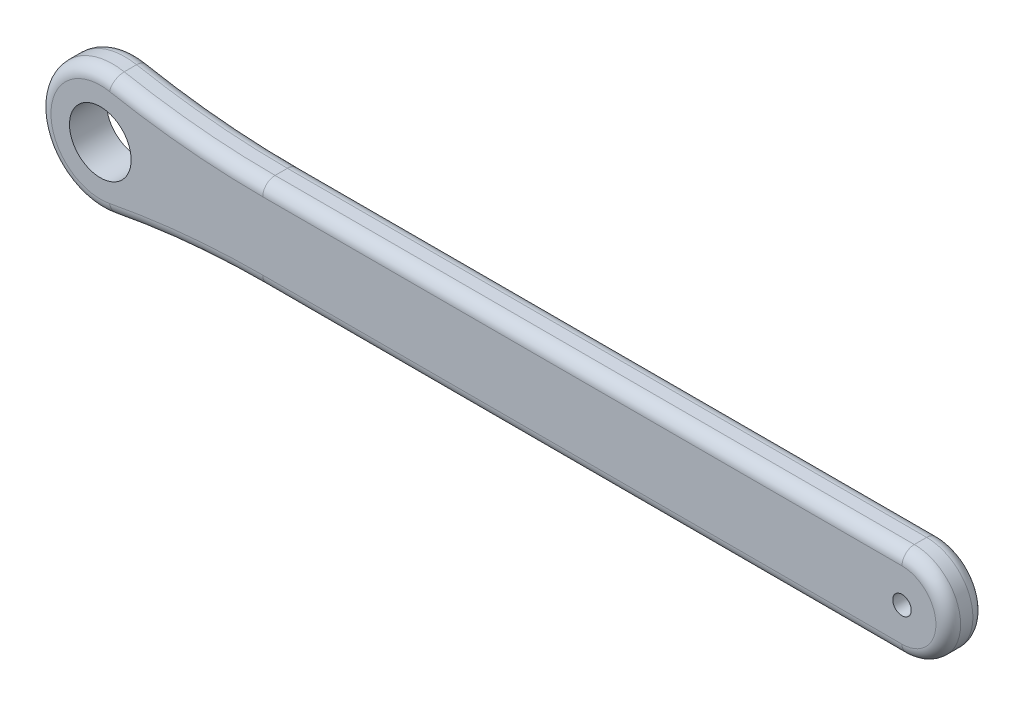
ISO-10303-21;
HEADER;
FILE_DESCRIPTION(('STEP AP214'),'2;1');
FILE_NAME('part.step','',(''),(''),'','','');
FILE_SCHEMA(('AUTOMOTIVE_DESIGN { 1 0 10303 214 1 1 1 1 }'));
ENDSEC;
DATA;
#1=APPLICATION_CONTEXT('core data for automotive mechanical design processes');
#2=APPLICATION_PROTOCOL_DEFINITION('international standard','automotive_design',2000,#1);
#3=PRODUCT_CONTEXT('',#1,'mechanical');
#4=PRODUCT('Part','Part','',(#3));
#5=PRODUCT_RELATED_PRODUCT_CATEGORY('part','',(#4));
#6=PRODUCT_DEFINITION_FORMATION('','',#4);
#7=PRODUCT_DEFINITION_CONTEXT('part definition',#1,'design');
#8=PRODUCT_DEFINITION('design','',#6,#7);
#9=PRODUCT_DEFINITION_SHAPE('','',#8);
#10=(LENGTH_UNIT() NAMED_UNIT(*) SI_UNIT(.MILLI.,.METRE.));
#11=(NAMED_UNIT(*) PLANE_ANGLE_UNIT() SI_UNIT($,.RADIAN.));
#12=(NAMED_UNIT(*) SI_UNIT($,.STERADIAN.) SOLID_ANGLE_UNIT());
#13=UNCERTAINTY_MEASURE_WITH_UNIT(LENGTH_MEASURE(1.E-05),#10,'distance_accuracy_value','');
#14=(GEOMETRIC_REPRESENTATION_CONTEXT(3) GLOBAL_UNCERTAINTY_ASSIGNED_CONTEXT((#13)) GLOBAL_UNIT_ASSIGNED_CONTEXT((#10,
#11,#12)) REPRESENTATION_CONTEXT('',''));
#15=CARTESIAN_POINT('',(0.,0.,0.));
#16=DIRECTION('',(0.,0.,1.));
#17=DIRECTION('',(1.,0.,0.));
#18=AXIS2_PLACEMENT_3D('',#15,#16,#17);
#19=CARTESIAN_POINT('',(130.,0.,6.));
#20=DIRECTION('',(0.,0.,1.));
#21=DIRECTION('',(1.,0.,0.));
#22=AXIS2_PLACEMENT_3D('',#19,#20,#21);
#23=PLANE('',#22);
#24=DIRECTION('',(1.,0.,0.));
#25=VECTOR('',#24,1.);
#26=CARTESIAN_POINT('',(130.,-5.5,6.));
#27=LINE('',#26,#25);
#28=CARTESIAN_POINT('',(26.3391343821317,-5.50000000000001,6.));
#29=VERTEX_POINT('',#28);
#30=CARTESIAN_POINT('',(130.,-5.5,6.));
#31=VERTEX_POINT('',#30);
#32=EDGE_CURVE('E226',#29,#31,#27,.T.);
#33=ORIENTED_EDGE('',*,*,#32,.T.);
#34=CARTESIAN_POINT('',(130.,0.,6.));
#35=DIRECTION('',(0.,0.,1.));
#36=DIRECTION('',(1.,0.,0.));
#37=AXIS2_PLACEMENT_3D('',#34,#35,#36);
#38=CIRCLE('',#37,5.5);
#39=CARTESIAN_POINT('',(130.,5.5,6.));
#40=VERTEX_POINT('',#39);
#41=EDGE_CURVE('E228',#31,#40,#38,.T.);
#42=ORIENTED_EDGE('',*,*,#41,.T.);
#43=DIRECTION('',(-1.,0.,0.));
#44=VECTOR('',#43,1.);
#45=CARTESIAN_POINT('',(26.3391343821319,5.50000000000001,6.));
#46=LINE('',#45,#44);
#47=CARTESIAN_POINT('',(26.3391343821319,5.50000000000001,6.));
#48=VERTEX_POINT('',#47);
#49=EDGE_CURVE('E218',#40,#48,#46,.T.);
#50=ORIENTED_EDGE('',*,*,#49,.T.);
#51=CARTESIAN_POINT('',(26.3391343821319,137.5,6.));
#52=DIRECTION('',(0.,0.,1.));
#53=DIRECTION('',(1.,0.,0.));
#54=AXIS2_PLACEMENT_3D('',#51,#52,#53);
#55=CIRCLE('',#54,132.);
#56=CARTESIAN_POINT('',(1.50509339326467,7.85714285714283,6.));
#57=VERTEX_POINT('',#56);
#58=EDGE_CURVE('E220',#48,#57,#55,.F.);
#59=ORIENTED_EDGE('',*,*,#58,.T.);
#60=CARTESIAN_POINT('',(0.,0.,6.));
#61=DIRECTION('',(0.,0.,1.));
#62=DIRECTION('',(1.,0.,0.));
#63=AXIS2_PLACEMENT_3D('',#60,#61,#62);
#64=CIRCLE('',#63,8.);
#65=CARTESIAN_POINT('',(1.50509339326467,-7.85714285714286,6.));
#66=VERTEX_POINT('',#65);
#67=EDGE_CURVE('E222',#57,#66,#64,.T.);
#68=ORIENTED_EDGE('',*,*,#67,.T.);
#69=CARTESIAN_POINT('',(26.3391343821317,-137.5,6.));
#70=DIRECTION('',(0.,0.,1.));
#71=DIRECTION('',(1.,0.,0.));
#72=AXIS2_PLACEMENT_3D('',#69,#70,#71);
#73=CIRCLE('',#72,132.);
#74=EDGE_CURVE('E224',#66,#29,#73,.F.);
#75=ORIENTED_EDGE('',*,*,#74,.T.);
#76=EDGE_LOOP('',(#33,#42,#50,#59,#68,#75));
#77=FACE_BOUND('',#76,.T.);
#78=CARTESIAN_POINT('',(0.,0.,6.));
#79=DIRECTION('',(0.,0.,1.));
#80=DIRECTION('',(1.,0.,0.));
#81=AXIS2_PLACEMENT_3D('',#78,#79,#80);
#82=CIRCLE('',#81,5.);
#83=CARTESIAN_POINT('',(5.,0.,6.));
#84=VERTEX_POINT('',#83);
#85=EDGE_CURVE('E195',#84,#84,#82,.T.);
#86=ORIENTED_EDGE('',*,*,#85,.F.);
#87=EDGE_LOOP('',(#86));
#88=FACE_BOUND('',#87,.T.);
#89=CARTESIAN_POINT('',(130.,0.,6.));
#90=DIRECTION('',(0.,0.,1.));
#91=DIRECTION('',(1.,0.,0.));
#92=AXIS2_PLACEMENT_3D('',#89,#90,#91);
#93=CIRCLE('',#92,1.5);
#94=CARTESIAN_POINT('',(131.5,0.,6.));
#95=VERTEX_POINT('',#94);
#96=EDGE_CURVE('E187',#95,#95,#93,.T.);
#97=ORIENTED_EDGE('',*,*,#96,.F.);
#98=EDGE_LOOP('',(#97));
#99=FACE_BOUND('',#98,.T.);
#100=ADVANCED_FACE('F32',(#77,#88,#99),#23,.T.);
#101=CARTESIAN_POINT('',(130.,0.,0.));
#102=DIRECTION('',(0.,0.,1.));
#103=DIRECTION('',(1.,0.,0.));
#104=AXIS2_PLACEMENT_3D('',#101,#102,#103);
#105=PLANE('',#104);
#106=DIRECTION('',(1.,0.,0.));
#107=VECTOR('',#106,1.);
#108=CARTESIAN_POINT('',(12.,3.99999999999999,0.));
#109=LINE('',#108,#107);
#110=CARTESIAN_POINT('',(12.,3.99999999999999,0.));
#111=VERTEX_POINT('',#110);
#112=CARTESIAN_POINT('',(123.,4.,0.));
#113=VERTEX_POINT('',#112);
#114=EDGE_CURVE('E177',#111,#113,#109,.T.);
#115=ORIENTED_EDGE('',*,*,#114,.F.);
#116=DIRECTION('',(0.,1.,0.));
#117=VECTOR('',#116,1.);
#118=CARTESIAN_POINT('',(12.,3.99999999999999,0.));
#119=LINE('',#118,#117);
#120=CARTESIAN_POINT('',(12.,-3.99999999999999,0.));
#121=VERTEX_POINT('',#120);
#122=EDGE_CURVE('E49',#121,#111,#119,.T.);
#123=ORIENTED_EDGE('',*,*,#122,.F.);
#124=DIRECTION('',(-1.,0.,0.));
#125=VECTOR('',#124,1.);
#126=CARTESIAN_POINT('',(12.,-3.99999999999999,0.));
#127=LINE('',#126,#125);
#128=CARTESIAN_POINT('',(123.,-4.,0.));
#129=VERTEX_POINT('',#128);
#130=EDGE_CURVE('E168',#129,#121,#127,.T.);
#131=ORIENTED_EDGE('',*,*,#130,.F.);
#132=DIRECTION('',(0.,-1.,0.));
#133=VECTOR('',#132,1.);
#134=CARTESIAN_POINT('',(123.,4.,0.));
#135=LINE('',#134,#133);
#136=EDGE_CURVE('E171',#113,#129,#135,.T.);
#137=ORIENTED_EDGE('',*,*,#136,.F.);
#138=EDGE_LOOP('',(#115,#123,#131,#137));
#139=FACE_BOUND('',#138,.T.);
#140=DIRECTION('',(-1.,0.,0.));
#141=VECTOR('',#140,1.);
#142=CARTESIAN_POINT('',(130.,5.5,0.));
#143=LINE('',#142,#141);
#144=CARTESIAN_POINT('',(26.3391343821319,5.50000000000001,0.));
#145=VERTEX_POINT('',#144);
#146=CARTESIAN_POINT('',(130.,5.5,0.));
#147=VERTEX_POINT('',#146);
#148=EDGE_CURVE('E253',#145,#147,#143,.F.);
#149=ORIENTED_EDGE('',*,*,#148,.T.);
#150=CARTESIAN_POINT('',(130.,0.,0.));
#151=DIRECTION('',(0.,0.,1.));
#152=DIRECTION('',(1.,0.,0.));
#153=AXIS2_PLACEMENT_3D('',#150,#151,#152);
#154=CIRCLE('',#153,5.5);
#155=CARTESIAN_POINT('',(130.,-5.5,0.));
#156=VERTEX_POINT('',#155);
#157=EDGE_CURVE('E263',#147,#156,#154,.F.);
#158=ORIENTED_EDGE('',*,*,#157,.T.);
#159=DIRECTION('',(1.,0.,0.));
#160=VECTOR('',#159,1.);
#161=CARTESIAN_POINT('',(130.,-5.5,0.));
#162=LINE('',#161,#160);
#163=CARTESIAN_POINT('',(26.3391343821317,-5.50000000000001,0.));
#164=VERTEX_POINT('',#163);
#165=EDGE_CURVE('E261',#156,#164,#162,.F.);
#166=ORIENTED_EDGE('',*,*,#165,.T.);
#167=CARTESIAN_POINT('',(26.3391343821317,-137.5,0.));
#168=DIRECTION('',(0.,0.,1.));
#169=DIRECTION('',(1.,0.,0.));
#170=AXIS2_PLACEMENT_3D('',#167,#168,#169);
#171=CIRCLE('',#170,132.);
#172=CARTESIAN_POINT('',(1.50509339326467,-7.85714285714286,0.));
#173=VERTEX_POINT('',#172);
#174=EDGE_CURVE('E259',#164,#173,#171,.T.);
#175=ORIENTED_EDGE('',*,*,#174,.T.);
#176=CARTESIAN_POINT('',(0.,0.,0.));
#177=DIRECTION('',(0.,0.,1.));
#178=DIRECTION('',(1.,0.,0.));
#179=AXIS2_PLACEMENT_3D('',#176,#177,#178);
#180=CIRCLE('',#179,8.);
#181=CARTESIAN_POINT('',(1.50509339326467,7.85714285714283,0.));
#182=VERTEX_POINT('',#181);
#183=EDGE_CURVE('E257',#173,#182,#180,.F.);
#184=ORIENTED_EDGE('',*,*,#183,.T.);
#185=CARTESIAN_POINT('',(26.3391343821319,137.5,0.));
#186=DIRECTION('',(0.,0.,1.));
#187=DIRECTION('',(1.,0.,0.));
#188=AXIS2_PLACEMENT_3D('',#185,#186,#187);
#189=CIRCLE('',#188,132.);
#190=EDGE_CURVE('E255',#182,#145,#189,.T.);
#191=ORIENTED_EDGE('',*,*,#190,.T.);
#192=EDGE_LOOP('',(#149,#158,#166,#175,#184,#191));
#193=FACE_BOUND('',#192,.T.);
#194=CARTESIAN_POINT('',(0.,0.,0.));
#195=DIRECTION('',(0.,0.,1.));
#196=DIRECTION('',(1.,0.,0.));
#197=AXIS2_PLACEMENT_3D('',#194,#195,#196);
#198=CIRCLE('',#197,5.);
#199=CARTESIAN_POINT('',(5.,0.,0.));
#200=VERTEX_POINT('',#199);
#201=EDGE_CURVE('E190',#200,#200,#198,.T.);
#202=ORIENTED_EDGE('',*,*,#201,.T.);
#203=EDGE_LOOP('',(#202));
#204=FACE_BOUND('',#203,.T.);
#205=CARTESIAN_POINT('',(130.,0.,0.));
#206=DIRECTION('',(0.,0.,1.));
#207=DIRECTION('',(1.,0.,0.));
#208=AXIS2_PLACEMENT_3D('',#205,#206,#207);
#209=CIRCLE('',#208,1.5);
#210=CARTESIAN_POINT('',(131.5,0.,0.));
#211=VERTEX_POINT('',#210);
#212=EDGE_CURVE('E191',#211,#211,#209,.T.);
#213=ORIENTED_EDGE('',*,*,#212,.T.);
#214=EDGE_LOOP('',(#213));
#215=FACE_BOUND('',#214,.T.);
#216=ADVANCED_FACE('F306',(#139,#193,#204,#215),#105,.F.);
#217=CARTESIAN_POINT('',(130.,0.,6.));
#218=DIRECTION('',(0.,0.,-1.));
#219=DIRECTION('',(-1.,0.,0.));
#220=AXIS2_PLACEMENT_3D('',#217,#218,#219);
#221=CYLINDRICAL_SURFACE('',#220,7.5);
#222=DIRECTION('',(0.,0.,-1.));
#223=VECTOR('',#222,1.);
#224=CARTESIAN_POINT('',(130.,7.5,6.));
#225=LINE('',#224,#223);
#226=CARTESIAN_POINT('',(130.,7.5,4.));
#227=VERTEX_POINT('',#226);
#228=CARTESIAN_POINT('',(130.,7.5,2.));
#229=VERTEX_POINT('',#228);
#230=EDGE_CURVE('E215',#227,#229,#225,.T.);
#231=ORIENTED_EDGE('',*,*,#230,.F.);
#232=CARTESIAN_POINT('',(130.,0.,4.));
#233=DIRECTION('',(0.,0.,1.));
#234=DIRECTION('',(1.,0.,0.));
#235=AXIS2_PLACEMENT_3D('',#232,#233,#234);
#236=CIRCLE('',#235,7.5);
#237=CARTESIAN_POINT('',(130.,-7.5,4.));
#238=VERTEX_POINT('',#237);
#239=EDGE_CURVE('E234',#227,#238,#236,.F.);
#240=ORIENTED_EDGE('',*,*,#239,.T.);
#241=DIRECTION('',(0.,0.,-1.));
#242=VECTOR('',#241,1.);
#243=CARTESIAN_POINT('',(130.,-7.5,6.));
#244=LINE('',#243,#242);
#245=CARTESIAN_POINT('',(130.,-7.5,2.));
#246=VERTEX_POINT('',#245);
#247=EDGE_CURVE('E198',#238,#246,#244,.T.);
#248=ORIENTED_EDGE('',*,*,#247,.T.);
#249=CARTESIAN_POINT('',(130.,0.,2.));
#250=DIRECTION('',(0.,0.,1.));
#251=DIRECTION('',(1.,0.,0.));
#252=AXIS2_PLACEMENT_3D('',#249,#250,#251);
#253=CIRCLE('',#252,7.5);
#254=EDGE_CURVE('E231',#246,#229,#253,.T.);
#255=ORIENTED_EDGE('',*,*,#254,.T.);
#256=EDGE_LOOP('',(#231,#240,#248,#255));
#257=FACE_BOUND('',#256,.T.);
#258=ADVANCED_FACE('F318',(#257),#221,.T.);
#259=CARTESIAN_POINT('',(26.3391343821319,7.50000000000001,6.));
#260=DIRECTION('',(0.,-1.,0.));
#261=DIRECTION('',(1.,0.,0.));
#262=AXIS2_PLACEMENT_3D('',#259,#260,#261);
#263=PLANE('',#262);
#264=DIRECTION('',(0.,0.,-1.));
#265=VECTOR('',#264,1.);
#266=CARTESIAN_POINT('',(26.3391343821319,7.49999999999998,6.));
#267=LINE('',#266,#265);
#268=CARTESIAN_POINT('',(26.3391343821319,7.49999999999998,4.));
#269=VERTEX_POINT('',#268);
#270=CARTESIAN_POINT('',(26.3391343821319,7.49999999999998,2.));
#271=VERTEX_POINT('',#270);
#272=EDGE_CURVE('E212',#269,#271,#267,.T.);
#273=ORIENTED_EDGE('',*,*,#272,.F.);
#274=DIRECTION('',(-1.,0.,0.));
#275=VECTOR('',#274,1.);
#276=CARTESIAN_POINT('',(130.,7.5,4.));
#277=LINE('',#276,#275);
#278=EDGE_CURVE('E11',#269,#227,#277,.F.);
#279=ORIENTED_EDGE('',*,*,#278,.T.);
#280=ORIENTED_EDGE('',*,*,#230,.T.);
#281=DIRECTION('',(-1.,0.,0.));
#282=VECTOR('',#281,1.);
#283=CARTESIAN_POINT('',(26.3391343821319,7.50000000000001,2.));
#284=LINE('',#283,#282);
#285=EDGE_CURVE('E41',#229,#271,#284,.T.);
#286=ORIENTED_EDGE('',*,*,#285,.T.);
#287=EDGE_LOOP('',(#273,#279,#280,#286));
#288=FACE_BOUND('',#287,.T.);
#289=ADVANCED_FACE('F394',(#288),#263,.F.);
#290=CARTESIAN_POINT('',(26.3391343821319,137.5,6.));
#291=DIRECTION('',(0.,0.,-1.));
#292=DIRECTION('',(-1.,0.,0.));
#293=AXIS2_PLACEMENT_3D('',#290,#291,#292);
#294=CYLINDRICAL_SURFACE('',#293,130.);
#295=DIRECTION('',(0.,0.,-1.));
#296=VECTOR('',#295,1.);
#297=CARTESIAN_POINT('',(1.88136674158085,9.82142857142857,6.));
#298=LINE('',#297,#296);
#299=CARTESIAN_POINT('',(1.88136674158085,9.82142857142857,4.));
#300=VERTEX_POINT('',#299);
#301=CARTESIAN_POINT('',(1.88136674158085,9.82142857142857,2.));
#302=VERTEX_POINT('',#301);
#303=EDGE_CURVE('E209',#300,#302,#298,.T.);
#304=ORIENTED_EDGE('',*,*,#303,.F.);
#305=CARTESIAN_POINT('',(26.3391343821319,137.5,4.));
#306=DIRECTION('',(0.,0.,1.));
#307=DIRECTION('',(1.,0.,0.));
#308=AXIS2_PLACEMENT_3D('',#305,#306,#307);
#309=CIRCLE('',#308,130.);
#310=EDGE_CURVE('E251',#300,#269,#309,.T.);
#311=ORIENTED_EDGE('',*,*,#310,.T.);
#312=ORIENTED_EDGE('',*,*,#272,.T.);
#313=CARTESIAN_POINT('',(26.3391343821319,137.5,2.));
#314=DIRECTION('',(0.,0.,1.));
#315=DIRECTION('',(1.,0.,0.));
#316=AXIS2_PLACEMENT_3D('',#313,#314,#315);
#317=CIRCLE('',#316,130.);
#318=EDGE_CURVE('E249',#271,#302,#317,.F.);
#319=ORIENTED_EDGE('',*,*,#318,.T.);
#320=EDGE_LOOP('',(#304,#311,#312,#319));
#321=FACE_BOUND('',#320,.T.);
#322=ADVANCED_FACE('F356',(#321),#294,.F.);
#323=CARTESIAN_POINT('',(0.,0.,6.));
#324=DIRECTION('',(0.,0.,-1.));
#325=DIRECTION('',(-1.,0.,0.));
#326=AXIS2_PLACEMENT_3D('',#323,#324,#325);
#327=CYLINDRICAL_SURFACE('',#326,10.);
#328=DIRECTION('',(0.,0.,-1.));
#329=VECTOR('',#328,1.);
#330=CARTESIAN_POINT('',(1.88136674158083,-9.82142857142856,6.));
#331=LINE('',#330,#329);
#332=CARTESIAN_POINT('',(1.88136674158083,-9.82142857142856,4.));
#333=VERTEX_POINT('',#332);
#334=CARTESIAN_POINT('',(1.88136674158083,-9.82142857142856,2.));
#335=VERTEX_POINT('',#334);
#336=EDGE_CURVE('E206',#333,#335,#331,.T.);
#337=ORIENTED_EDGE('',*,*,#336,.F.);
#338=CARTESIAN_POINT('',(0.,0.,4.));
#339=DIRECTION('',(0.,0.,1.));
#340=DIRECTION('',(1.,0.,0.));
#341=AXIS2_PLACEMENT_3D('',#338,#339,#340);
#342=CIRCLE('',#341,10.);
#343=EDGE_CURVE('E247',#333,#300,#342,.F.);
#344=ORIENTED_EDGE('',*,*,#343,.T.);
#345=ORIENTED_EDGE('',*,*,#303,.T.);
#346=CARTESIAN_POINT('',(0.,0.,2.));
#347=DIRECTION('',(0.,0.,1.));
#348=DIRECTION('',(1.,0.,0.));
#349=AXIS2_PLACEMENT_3D('',#346,#347,#348);
#350=CIRCLE('',#349,10.);
#351=EDGE_CURVE('E245',#302,#335,#350,.T.);
#352=ORIENTED_EDGE('',*,*,#351,.T.);
#353=EDGE_LOOP('',(#337,#344,#345,#352));
#354=FACE_BOUND('',#353,.T.);
#355=ADVANCED_FACE('F354',(#354),#327,.T.);
#356=CARTESIAN_POINT('',(26.3391343821317,-137.5,6.));
#357=DIRECTION('',(0.,0.,-1.));
#358=DIRECTION('',(-1.,0.,0.));
#359=AXIS2_PLACEMENT_3D('',#356,#357,#358);
#360=CYLINDRICAL_SURFACE('',#359,130.);
#361=DIRECTION('',(0.,0.,-1.));
#362=VECTOR('',#361,1.);
#363=CARTESIAN_POINT('',(26.3391343821317,-7.50000000000001,6.));
#364=LINE('',#363,#362);
#365=CARTESIAN_POINT('',(26.3391343821317,-7.50000000000001,4.));
#366=VERTEX_POINT('',#365);
#367=CARTESIAN_POINT('',(26.3391343821317,-7.50000000000001,2.));
#368=VERTEX_POINT('',#367);
#369=EDGE_CURVE('E203',#366,#368,#364,.T.);
#370=ORIENTED_EDGE('',*,*,#369,.F.);
#371=CARTESIAN_POINT('',(26.3391343821317,-137.5,4.));
#372=DIRECTION('',(0.,0.,1.));
#373=DIRECTION('',(1.,0.,0.));
#374=AXIS2_PLACEMENT_3D('',#371,#372,#373);
#375=CIRCLE('',#374,130.);
#376=EDGE_CURVE('E243',#366,#333,#375,.T.);
#377=ORIENTED_EDGE('',*,*,#376,.T.);
#378=ORIENTED_EDGE('',*,*,#336,.T.);
#379=CARTESIAN_POINT('',(26.3391343821317,-137.5,2.));
#380=DIRECTION('',(0.,0.,1.));
#381=DIRECTION('',(1.,0.,0.));
#382=AXIS2_PLACEMENT_3D('',#379,#380,#381);
#383=CIRCLE('',#382,130.);
#384=EDGE_CURVE('E241',#335,#368,#383,.F.);
#385=ORIENTED_EDGE('',*,*,#384,.T.);
#386=EDGE_LOOP('',(#370,#377,#378,#385));
#387=FACE_BOUND('',#386,.T.);
#388=ADVANCED_FACE('F341',(#387),#360,.F.);
#389=CARTESIAN_POINT('',(130.,-7.5,6.));
#390=DIRECTION('',(0.,1.,0.));
#391=DIRECTION('',(-1.,0.,0.));
#392=AXIS2_PLACEMENT_3D('',#389,#390,#391);
#393=PLANE('',#392);
#394=ORIENTED_EDGE('',*,*,#247,.F.);
#395=DIRECTION('',(1.,0.,0.));
#396=VECTOR('',#395,1.);
#397=CARTESIAN_POINT('',(26.3391343821317,-7.50000000000001,4.));
#398=LINE('',#397,#396);
#399=EDGE_CURVE('E239',#238,#366,#398,.F.);
#400=ORIENTED_EDGE('',*,*,#399,.T.);
#401=ORIENTED_EDGE('',*,*,#369,.T.);
#402=DIRECTION('',(1.,0.,0.));
#403=VECTOR('',#402,1.);
#404=CARTESIAN_POINT('',(130.,-7.5,2.));
#405=LINE('',#404,#403);
#406=EDGE_CURVE('E237',#368,#246,#405,.T.);
#407=ORIENTED_EDGE('',*,*,#406,.T.);
#408=EDGE_LOOP('',(#394,#400,#401,#407));
#409=FACE_BOUND('',#408,.T.);
#410=ADVANCED_FACE('F314',(#409),#393,.F.);
#411=CARTESIAN_POINT('',(0.,0.,6.));
#412=DIRECTION('',(0.,0.,-1.));
#413=DIRECTION('',(-1.,0.,0.));
#414=AXIS2_PLACEMENT_3D('',#411,#412,#413);
#415=CYLINDRICAL_SURFACE('',#414,5.);
#416=ORIENTED_EDGE('',*,*,#85,.T.);
#417=EDGE_LOOP('',(#416));
#418=FACE_BOUND('',#417,.T.);
#419=ORIENTED_EDGE('',*,*,#201,.F.);
#420=EDGE_LOOP('',(#419));
#421=FACE_BOUND('',#420,.T.);
#422=ADVANCED_FACE('F383',(#418,#421),#415,.F.);
#423=CARTESIAN_POINT('',(130.,0.,6.));
#424=DIRECTION('',(0.,0.,-1.));
#425=DIRECTION('',(-1.,0.,0.));
#426=AXIS2_PLACEMENT_3D('',#423,#424,#425);
#427=CYLINDRICAL_SURFACE('',#426,1.5);
#428=ORIENTED_EDGE('',*,*,#96,.T.);
#429=EDGE_LOOP('',(#428));
#430=FACE_BOUND('',#429,.T.);
#431=ORIENTED_EDGE('',*,*,#212,.F.);
#432=EDGE_LOOP('',(#431));
#433=FACE_BOUND('',#432,.T.);
#434=ADVANCED_FACE('F412',(#430,#433),#427,.F.);
#435=CARTESIAN_POINT('',(0.,0.,4.));
#436=DIRECTION('',(0.,0.,1.));
#437=DIRECTION('',(1.,0.,0.));
#438=AXIS2_PLACEMENT_3D('',#435,#436,#437);
#439=TOROIDAL_SURFACE('',#438,8.,2.);
#440=CARTESIAN_POINT('',(1.50509339326468,7.85714285714286,4.));
#441=DIRECTION('',(0.982142857142857,-0.188136674158084,0.));
#442=DIRECTION('',(0.188136674158085,0.982142857142857,0.));
#443=AXIS2_PLACEMENT_3D('',#440,#441,#442);
#444=CIRCLE('',#443,2.);
#445=EDGE_CURVE('E277',#300,#57,#444,.T.);
#446=ORIENTED_EDGE('',*,*,#445,.F.);
#447=ORIENTED_EDGE('',*,*,#343,.F.);
#448=CARTESIAN_POINT('',(1.50509339326467,-7.85714285714286,4.));
#449=DIRECTION('',(0.982142857142857,0.188136674158084,0.));
#450=DIRECTION('',(-0.188136674158084,0.982142857142857,0.));
#451=AXIS2_PLACEMENT_3D('',#448,#449,#450);
#452=CIRCLE('',#451,2.);
#453=EDGE_CURVE('E194',#66,#333,#452,.T.);
#454=ORIENTED_EDGE('',*,*,#453,.F.);
#455=ORIENTED_EDGE('',*,*,#67,.F.);
#456=EDGE_LOOP('',(#446,#447,#454,#455));
#457=FACE_BOUND('',#456,.T.);
#458=ADVANCED_FACE('F350',(#457),#439,.T.);
#459=CARTESIAN_POINT('',(26.3391343821317,-137.5,4.));
#460=DIRECTION('',(0.,0.,1.));
#461=DIRECTION('',(1.,0.,0.));
#462=AXIS2_PLACEMENT_3D('',#459,#460,#461);
#463=TOROIDAL_SURFACE('',#462,132.,2.);
#464=ORIENTED_EDGE('',*,*,#453,.T.);
#465=ORIENTED_EDGE('',*,*,#376,.F.);
#466=CARTESIAN_POINT('',(26.3391343821317,-5.50000000000001,4.));
#467=DIRECTION('',(1.,0.,0.));
#468=DIRECTION('',(0.,0.,-1.));
#469=AXIS2_PLACEMENT_3D('',#466,#467,#468);
#470=CIRCLE('',#469,2.);
#471=EDGE_CURVE('E274',#29,#366,#470,.T.);
#472=ORIENTED_EDGE('',*,*,#471,.F.);
#473=ORIENTED_EDGE('',*,*,#74,.F.);
#474=EDGE_LOOP('',(#464,#465,#472,#473));
#475=FACE_BOUND('',#474,.T.);
#476=ADVANCED_FACE('F344',(#475),#463,.T.);
#477=CARTESIAN_POINT('',(26.3391343821319,137.5,4.));
#478=DIRECTION('',(0.,0.,1.));
#479=DIRECTION('',(1.,0.,0.));
#480=AXIS2_PLACEMENT_3D('',#477,#478,#479);
#481=TOROIDAL_SURFACE('',#480,132.,2.);
#482=ORIENTED_EDGE('',*,*,#445,.T.);
#483=ORIENTED_EDGE('',*,*,#58,.F.);
#484=CARTESIAN_POINT('',(26.3391343821319,5.49999999999998,4.));
#485=DIRECTION('',(1.,0.,0.));
#486=DIRECTION('',(0.,0.,-1.));
#487=AXIS2_PLACEMENT_3D('',#484,#485,#486);
#488=CIRCLE('',#487,2.);
#489=EDGE_CURVE('E271',#269,#48,#488,.T.);
#490=ORIENTED_EDGE('',*,*,#489,.F.);
#491=ORIENTED_EDGE('',*,*,#310,.F.);
#492=EDGE_LOOP('',(#482,#483,#490,#491));
#493=FACE_BOUND('',#492,.T.);
#494=ADVANCED_FACE('F406',(#493),#481,.T.);
#495=CARTESIAN_POINT('',(130.,-5.5,4.));
#496=DIRECTION('',(-1.,0.,0.));
#497=DIRECTION('',(0.,-1.,0.));
#498=AXIS2_PLACEMENT_3D('',#495,#496,#497);
#499=CYLINDRICAL_SURFACE('',#498,2.);
#500=ORIENTED_EDGE('',*,*,#471,.T.);
#501=ORIENTED_EDGE('',*,*,#399,.F.);
#502=CARTESIAN_POINT('',(130.,-5.5,4.));
#503=DIRECTION('',(1.,0.,0.));
#504=DIRECTION('',(0.,0.,-1.));
#505=AXIS2_PLACEMENT_3D('',#502,#503,#504);
#506=CIRCLE('',#505,2.);
#507=EDGE_CURVE('E269',#31,#238,#506,.T.);
#508=ORIENTED_EDGE('',*,*,#507,.F.);
#509=ORIENTED_EDGE('',*,*,#32,.F.);
#510=EDGE_LOOP('',(#500,#501,#508,#509));
#511=FACE_BOUND('',#510,.T.);
#512=ADVANCED_FACE('F338',(#511),#499,.T.);
#513=CARTESIAN_POINT('',(130.,5.5,4.));
#514=DIRECTION('',(1.,0.,0.));
#515=DIRECTION('',(0.,1.,0.));
#516=AXIS2_PLACEMENT_3D('',#513,#514,#515);
#517=CYLINDRICAL_SURFACE('',#516,2.);
#518=ORIENTED_EDGE('',*,*,#489,.T.);
#519=ORIENTED_EDGE('',*,*,#49,.F.);
#520=CARTESIAN_POINT('',(130.,5.5,4.));
#521=DIRECTION('',(1.,0.,0.));
#522=DIRECTION('',(0.,0.,-1.));
#523=AXIS2_PLACEMENT_3D('',#520,#521,#522);
#524=CIRCLE('',#523,2.);
#525=EDGE_CURVE('E267',#227,#40,#524,.T.);
#526=ORIENTED_EDGE('',*,*,#525,.F.);
#527=ORIENTED_EDGE('',*,*,#278,.F.);
#528=EDGE_LOOP('',(#518,#519,#526,#527));
#529=FACE_BOUND('',#528,.T.);
#530=ADVANCED_FACE('F329',(#529),#517,.T.);
#531=CARTESIAN_POINT('',(130.,0.,4.));
#532=DIRECTION('',(0.,0.,1.));
#533=DIRECTION('',(1.,0.,0.));
#534=AXIS2_PLACEMENT_3D('',#531,#532,#533);
#535=TOROIDAL_SURFACE('',#534,5.5,2.);
#536=ORIENTED_EDGE('',*,*,#507,.T.);
#537=ORIENTED_EDGE('',*,*,#239,.F.);
#538=ORIENTED_EDGE('',*,*,#525,.T.);
#539=ORIENTED_EDGE('',*,*,#41,.F.);
#540=EDGE_LOOP('',(#536,#537,#538,#539));
#541=FACE_BOUND('',#540,.T.);
#542=ADVANCED_FACE('F322',(#541),#535,.T.);
#543=CARTESIAN_POINT('',(0.,0.,2.));
#544=DIRECTION('',(0.,0.,1.));
#545=DIRECTION('',(1.,0.,0.));
#546=AXIS2_PLACEMENT_3D('',#543,#544,#545);
#547=TOROIDAL_SURFACE('',#546,8.,2.);
#548=CARTESIAN_POINT('',(1.50509339326468,7.85714285714286,2.));
#549=DIRECTION('',(0.982142857142857,-0.188136674158084,0.));
#550=DIRECTION('',(0.188136674158084,0.982142857142857,0.));
#551=AXIS2_PLACEMENT_3D('',#548,#549,#550);
#552=CIRCLE('',#551,2.);
#553=EDGE_CURVE('E289',#182,#302,#552,.T.);
#554=ORIENTED_EDGE('',*,*,#553,.F.);
#555=ORIENTED_EDGE('',*,*,#183,.F.);
#556=CARTESIAN_POINT('',(1.50509339326467,-7.85714285714286,2.));
#557=DIRECTION('',(0.982142857142858,0.188136674158083,0.));
#558=DIRECTION('',(-0.188136674158083,0.982142857142858,0.));
#559=AXIS2_PLACEMENT_3D('',#556,#557,#558);
#560=CIRCLE('',#559,2.);
#561=EDGE_CURVE('E36',#335,#173,#560,.T.);
#562=ORIENTED_EDGE('',*,*,#561,.F.);
#563=ORIENTED_EDGE('',*,*,#351,.F.);
#564=EDGE_LOOP('',(#554,#555,#562,#563));
#565=FACE_BOUND('',#564,.T.);
#566=ADVANCED_FACE('F34',(#565),#547,.T.);
#567=CARTESIAN_POINT('',(26.3391343821317,-137.5,2.));
#568=DIRECTION('',(0.,0.,1.));
#569=DIRECTION('',(1.,0.,0.));
#570=AXIS2_PLACEMENT_3D('',#567,#568,#569);
#571=TOROIDAL_SURFACE('',#570,132.,2.);
#572=ORIENTED_EDGE('',*,*,#561,.T.);
#573=ORIENTED_EDGE('',*,*,#174,.F.);
#574=CARTESIAN_POINT('',(26.3391343821317,-5.50000000000001,2.));
#575=DIRECTION('',(1.,0.,0.));
#576=DIRECTION('',(0.,0.,-1.));
#577=AXIS2_PLACEMENT_3D('',#574,#575,#576);
#578=CIRCLE('',#577,2.);
#579=EDGE_CURVE('E287',#368,#164,#578,.T.);
#580=ORIENTED_EDGE('',*,*,#579,.F.);
#581=ORIENTED_EDGE('',*,*,#384,.F.);
#582=EDGE_LOOP('',(#572,#573,#580,#581));
#583=FACE_BOUND('',#582,.T.);
#584=ADVANCED_FACE('F300',(#583),#571,.T.);
#585=CARTESIAN_POINT('',(26.3391343821319,137.5,2.));
#586=DIRECTION('',(0.,0.,1.));
#587=DIRECTION('',(1.,0.,0.));
#588=AXIS2_PLACEMENT_3D('',#585,#586,#587);
#589=TOROIDAL_SURFACE('',#588,132.,2.);
#590=ORIENTED_EDGE('',*,*,#553,.T.);
#591=ORIENTED_EDGE('',*,*,#318,.F.);
#592=CARTESIAN_POINT('',(26.3391343821319,5.49999999999998,2.));
#593=DIRECTION('',(1.,0.,0.));
#594=DIRECTION('',(0.,0.,-1.));
#595=AXIS2_PLACEMENT_3D('',#592,#593,#594);
#596=CIRCLE('',#595,2.);
#597=EDGE_CURVE('E284',#145,#271,#596,.T.);
#598=ORIENTED_EDGE('',*,*,#597,.F.);
#599=ORIENTED_EDGE('',*,*,#190,.F.);
#600=EDGE_LOOP('',(#590,#591,#598,#599));
#601=FACE_BOUND('',#600,.T.);
#602=ADVANCED_FACE('F358',(#601),#589,.T.);
#603=CARTESIAN_POINT('',(130.,-5.5,2.));
#604=DIRECTION('',(1.,0.,0.));
#605=DIRECTION('',(0.,1.,0.));
#606=AXIS2_PLACEMENT_3D('',#603,#604,#605);
#607=CYLINDRICAL_SURFACE('',#606,2.);
#608=ORIENTED_EDGE('',*,*,#579,.T.);
#609=ORIENTED_EDGE('',*,*,#165,.F.);
#610=CARTESIAN_POINT('',(130.,-5.5,2.));
#611=DIRECTION('',(1.,0.,0.));
#612=DIRECTION('',(0.,0.,-1.));
#613=AXIS2_PLACEMENT_3D('',#610,#611,#612);
#614=CIRCLE('',#613,2.);
#615=EDGE_CURVE('E57',#246,#156,#614,.T.);
#616=ORIENTED_EDGE('',*,*,#615,.F.);
#617=ORIENTED_EDGE('',*,*,#406,.F.);
#618=EDGE_LOOP('',(#608,#609,#616,#617));
#619=FACE_BOUND('',#618,.T.);
#620=ADVANCED_FACE('F310',(#619),#607,.T.);
#621=CARTESIAN_POINT('',(26.3391343821319,5.50000000000001,2.));
#622=DIRECTION('',(-1.,0.,0.));
#623=DIRECTION('',(0.,-1.,0.));
#624=AXIS2_PLACEMENT_3D('',#621,#622,#623);
#625=CYLINDRICAL_SURFACE('',#624,2.);
#626=ORIENTED_EDGE('',*,*,#597,.T.);
#627=ORIENTED_EDGE('',*,*,#285,.F.);
#628=CARTESIAN_POINT('',(130.,5.5,2.));
#629=DIRECTION('',(1.,0.,0.));
#630=DIRECTION('',(0.,0.,-1.));
#631=AXIS2_PLACEMENT_3D('',#628,#629,#630);
#632=CIRCLE('',#631,2.);
#633=EDGE_CURVE('E183',#147,#229,#632,.T.);
#634=ORIENTED_EDGE('',*,*,#633,.F.);
#635=ORIENTED_EDGE('',*,*,#148,.F.);
#636=EDGE_LOOP('',(#626,#627,#634,#635));
#637=FACE_BOUND('',#636,.T.);
#638=ADVANCED_FACE('F362',(#637),#625,.T.);
#639=CARTESIAN_POINT('',(130.,0.,2.));
#640=DIRECTION('',(0.,0.,1.));
#641=DIRECTION('',(1.,0.,0.));
#642=AXIS2_PLACEMENT_3D('',#639,#640,#641);
#643=TOROIDAL_SURFACE('',#642,5.5,2.);
#644=ORIENTED_EDGE('',*,*,#615,.T.);
#645=ORIENTED_EDGE('',*,*,#157,.F.);
#646=ORIENTED_EDGE('',*,*,#633,.T.);
#647=ORIENTED_EDGE('',*,*,#254,.F.);
#648=EDGE_LOOP('',(#644,#645,#646,#647));
#649=FACE_BOUND('',#648,.T.);
#650=ADVANCED_FACE('F364',(#649),#643,.T.);
#651=CARTESIAN_POINT('',(12.,3.99999999999999,4.));
#652=DIRECTION('',(-1.,0.,0.));
#653=DIRECTION('',(0.,0.,1.));
#654=AXIS2_PLACEMENT_3D('',#651,#652,#653);
#655=PLANE('',#654);
#656=ORIENTED_EDGE('',*,*,#122,.T.);
#657=DIRECTION('',(0.,0.,-1.));
#658=VECTOR('',#657,1.);
#659=CARTESIAN_POINT('',(12.,3.99999999999999,4.));
#660=LINE('',#659,#658);
#661=CARTESIAN_POINT('',(12.,3.99999999999999,4.));
#662=VERTEX_POINT('',#661);
#663=EDGE_CURVE('E146',#662,#111,#660,.T.);
#664=ORIENTED_EDGE('',*,*,#663,.F.);
#665=DIRECTION('',(0.,1.,0.));
#666=VECTOR('',#665,1.);
#667=CARTESIAN_POINT('',(12.,3.99999999999999,4.));
#668=LINE('',#667,#666);
#669=CARTESIAN_POINT('',(12.,-3.99999999999999,4.));
#670=VERTEX_POINT('',#669);
#671=EDGE_CURVE('E150',#670,#662,#668,.T.);
#672=ORIENTED_EDGE('',*,*,#671,.F.);
#673=DIRECTION('',(0.,0.,-1.));
#674=VECTOR('',#673,1.);
#675=CARTESIAN_POINT('',(12.,-3.99999999999999,4.));
#676=LINE('',#675,#674);
#677=EDGE_CURVE('E181',#670,#121,#676,.T.);
#678=ORIENTED_EDGE('',*,*,#677,.T.);
#679=EDGE_LOOP('',(#656,#664,#672,#678));
#680=FACE_BOUND('',#679,.T.);
#681=ADVANCED_FACE('F148',(#680),#655,.F.);
#682=CARTESIAN_POINT('',(12.,-3.99999999999999,4.));
#683=DIRECTION('',(0.,-1.,0.));
#684=DIRECTION('',(1.,0.,0.));
#685=AXIS2_PLACEMENT_3D('',#682,#683,#684);
#686=PLANE('',#685);
#687=ORIENTED_EDGE('',*,*,#130,.T.);
#688=ORIENTED_EDGE('',*,*,#677,.F.);
#689=DIRECTION('',(-1.,0.,0.));
#690=VECTOR('',#689,1.);
#691=CARTESIAN_POINT('',(12.,-3.99999999999999,4.));
#692=LINE('',#691,#690);
#693=CARTESIAN_POINT('',(123.,-4.,4.));
#694=VERTEX_POINT('',#693);
#695=EDGE_CURVE('E156',#694,#670,#692,.T.);
#696=ORIENTED_EDGE('',*,*,#695,.F.);
#697=DIRECTION('',(0.,0.,-1.));
#698=VECTOR('',#697,1.);
#699=CARTESIAN_POINT('',(123.,-4.,4.));
#700=LINE('',#699,#698);
#701=EDGE_CURVE('E184',#694,#129,#700,.T.);
#702=ORIENTED_EDGE('',*,*,#701,.T.);
#703=EDGE_LOOP('',(#687,#688,#696,#702));
#704=FACE_BOUND('',#703,.T.);
#705=ADVANCED_FACE('F371',(#704),#686,.F.);
#706=CARTESIAN_POINT('',(123.,4.,4.));
#707=DIRECTION('',(1.,0.,0.));
#708=DIRECTION('',(0.,0.,-1.));
#709=AXIS2_PLACEMENT_3D('',#706,#707,#708);
#710=PLANE('',#709);
#711=ORIENTED_EDGE('',*,*,#136,.T.);
#712=ORIENTED_EDGE('',*,*,#701,.F.);
#713=DIRECTION('',(0.,-1.,0.));
#714=VECTOR('',#713,1.);
#715=CARTESIAN_POINT('',(123.,4.,4.));
#716=LINE('',#715,#714);
#717=CARTESIAN_POINT('',(123.,4.,4.));
#718=VERTEX_POINT('',#717);
#719=EDGE_CURVE('E164',#718,#694,#716,.T.);
#720=ORIENTED_EDGE('',*,*,#719,.F.);
#721=DIRECTION('',(0.,0.,-1.));
#722=VECTOR('',#721,1.);
#723=CARTESIAN_POINT('',(123.,4.,4.));
#724=LINE('',#723,#722);
#725=EDGE_CURVE('E155',#718,#113,#724,.T.);
#726=ORIENTED_EDGE('',*,*,#725,.T.);
#727=EDGE_LOOP('',(#711,#712,#720,#726));
#728=FACE_BOUND('',#727,.T.);
#729=ADVANCED_FACE('F425',(#728),#710,.F.);
#730=CARTESIAN_POINT('',(12.,3.99999999999999,4.));
#731=DIRECTION('',(0.,1.,0.));
#732=DIRECTION('',(-1.,0.,0.));
#733=AXIS2_PLACEMENT_3D('',#730,#731,#732);
#734=PLANE('',#733);
#735=ORIENTED_EDGE('',*,*,#114,.T.);
#736=ORIENTED_EDGE('',*,*,#725,.F.);
#737=DIRECTION('',(1.,0.,0.));
#738=VECTOR('',#737,1.);
#739=CARTESIAN_POINT('',(12.,3.99999999999999,4.));
#740=LINE('',#739,#738);
#741=EDGE_CURVE('E159',#662,#718,#740,.T.);
#742=ORIENTED_EDGE('',*,*,#741,.F.);
#743=ORIENTED_EDGE('',*,*,#663,.T.);
#744=EDGE_LOOP('',(#735,#736,#742,#743));
#745=FACE_BOUND('',#744,.T.);
#746=ADVANCED_FACE('F160',(#745),#734,.F.);
#747=CARTESIAN_POINT('',(0.,0.,4.));
#748=DIRECTION('',(0.,0.,1.));
#749=DIRECTION('',(1.,0.,0.));
#750=AXIS2_PLACEMENT_3D('',#747,#748,#749);
#751=PLANE('',#750);
#752=ORIENTED_EDGE('',*,*,#671,.T.);
#753=ORIENTED_EDGE('',*,*,#741,.T.);
#754=ORIENTED_EDGE('',*,*,#719,.T.);
#755=ORIENTED_EDGE('',*,*,#695,.T.);
#756=EDGE_LOOP('',(#752,#753,#754,#755));
#757=FACE_BOUND('',#756,.T.);
#758=ADVANCED_FACE('F166',(#757),#751,.F.);
#759=CLOSED_SHELL('',(#100,#216,#258,#289,#322,#355,#388,#410,#422,#434,#458,#476,#494,#512,
#530,#542,#566,#584,#602,#620,#638,#650,#681,#705,#729,#746,#758));
#760=MANIFOLD_SOLID_BREP('B2',#759);
#761=ADVANCED_BREP_SHAPE_REPRESENTATION('',(#18,#760),#14);
#762=SHAPE_DEFINITION_REPRESENTATION(#9,#761);
ENDSEC;
END-ISO-10303-21;
